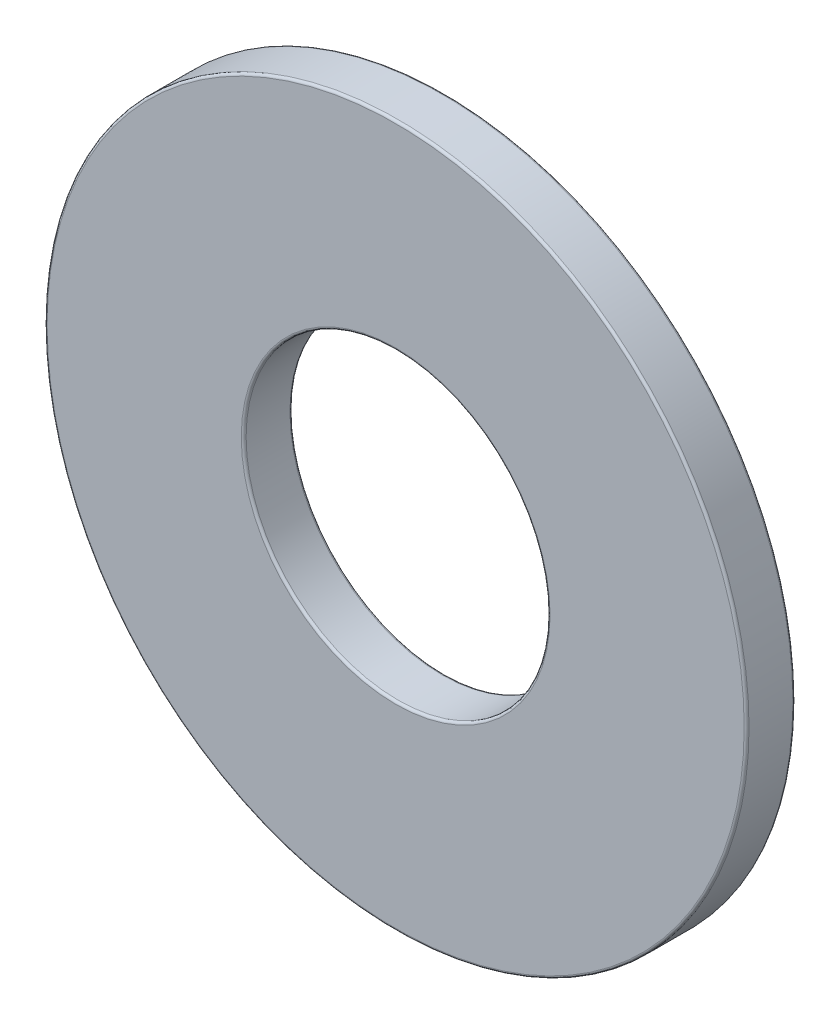
ISO-10303-21;
HEADER;
FILE_DESCRIPTION(('STEP AP214'),'2;1');
FILE_NAME('part.step','',(''),(''),'','','');
FILE_SCHEMA(('AUTOMOTIVE_DESIGN { 1 0 10303 214 1 1 1 1 }'));
ENDSEC;
DATA;
#1=APPLICATION_CONTEXT('core data for automotive mechanical design processes');
#2=APPLICATION_PROTOCOL_DEFINITION('international standard','automotive_design',2000,#1);
#3=PRODUCT_CONTEXT('',#1,'mechanical');
#4=PRODUCT('Part','Part','',(#3));
#5=PRODUCT_RELATED_PRODUCT_CATEGORY('part','',(#4));
#6=PRODUCT_DEFINITION_FORMATION('','',#4);
#7=PRODUCT_DEFINITION_CONTEXT('part definition',#1,'design');
#8=PRODUCT_DEFINITION('design','',#6,#7);
#9=PRODUCT_DEFINITION_SHAPE('','',#8);
#10=(LENGTH_UNIT() NAMED_UNIT(*) SI_UNIT(.MILLI.,.METRE.));
#11=(NAMED_UNIT(*) PLANE_ANGLE_UNIT() SI_UNIT($,.RADIAN.));
#12=(NAMED_UNIT(*) SI_UNIT($,.STERADIAN.) SOLID_ANGLE_UNIT());
#13=UNCERTAINTY_MEASURE_WITH_UNIT(LENGTH_MEASURE(1.E-05),#10,'distance_accuracy_value','');
#14=(GEOMETRIC_REPRESENTATION_CONTEXT(3) GLOBAL_UNCERTAINTY_ASSIGNED_CONTEXT((#13)) GLOBAL_UNIT_ASSIGNED_CONTEXT((#10,
#11,#12)) REPRESENTATION_CONTEXT('',''));
#15=CARTESIAN_POINT('',(0.,0.,0.));
#16=DIRECTION('',(0.,0.,1.));
#17=DIRECTION('',(1.,0.,0.));
#18=AXIS2_PLACEMENT_3D('',#15,#16,#17);
#19=CARTESIAN_POINT('',(0.,0.,1.651));
#20=DIRECTION('',(0.,0.,1.));
#21=DIRECTION('',(1.,0.,0.));
#22=AXIS2_PLACEMENT_3D('',#19,#20,#21);
#23=PLANE('',#22);
#24=CARTESIAN_POINT('',(0.,0.,1.651));
#25=DIRECTION('',(0.,0.,1.));
#26=DIRECTION('',(1.,0.,0.));
#27=AXIS2_PLACEMENT_3D('',#24,#25,#26);
#28=CIRCLE('',#27,10.4775);
#29=CARTESIAN_POINT('',(10.4775,0.,1.651));
#30=VERTEX_POINT('',#29);
#31=EDGE_CURVE('E10',#30,#30,#28,.F.);
#32=ORIENTED_EDGE('',*,*,#31,.T.);
#33=EDGE_LOOP('',(#32));
#34=FACE_BOUND('',#33,.T.);
#35=CARTESIAN_POINT('',(0.,0.,1.651));
#36=DIRECTION('',(0.,0.,1.));
#37=DIRECTION('',(1.,0.,0.));
#38=AXIS2_PLACEMENT_3D('',#35,#36,#37);
#39=CIRCLE('',#38,23.6474);
#40=CARTESIAN_POINT('',(23.6474,0.,1.651));
#41=VERTEX_POINT('',#40);
#42=EDGE_CURVE('E42',#41,#41,#39,.T.);
#43=ORIENTED_EDGE('',*,*,#42,.T.);
#44=EDGE_LOOP('',(#43));
#45=FACE_BOUND('',#44,.T.);
#46=ADVANCED_FACE('F35',(#34,#45),#23,.T.);
#47=CARTESIAN_POINT('',(0.,0.,-1.651));
#48=DIRECTION('',(0.,0.,1.));
#49=DIRECTION('',(1.,0.,0.));
#50=AXIS2_PLACEMENT_3D('',#47,#48,#49);
#51=PLANE('',#50);
#52=CARTESIAN_POINT('',(0.,0.,-1.651));
#53=DIRECTION('',(0.,0.,1.));
#54=DIRECTION('',(1.,0.,0.));
#55=AXIS2_PLACEMENT_3D('',#52,#53,#54);
#56=CIRCLE('',#55,10.4775);
#57=CARTESIAN_POINT('',(10.4775,0.,-1.651));
#58=VERTEX_POINT('',#57);
#59=EDGE_CURVE('E61',#58,#58,#56,.T.);
#60=ORIENTED_EDGE('',*,*,#59,.T.);
#61=EDGE_LOOP('',(#60));
#62=FACE_BOUND('',#61,.T.);
#63=CARTESIAN_POINT('',(0.,0.,-1.651));
#64=DIRECTION('',(0.,0.,1.));
#65=DIRECTION('',(1.,0.,0.));
#66=AXIS2_PLACEMENT_3D('',#63,#64,#65);
#67=CIRCLE('',#66,23.6474);
#68=CARTESIAN_POINT('',(23.6474,0.,-1.651));
#69=VERTEX_POINT('',#68);
#70=EDGE_CURVE('E64',#69,#69,#67,.F.);
#71=ORIENTED_EDGE('',*,*,#70,.T.);
#72=EDGE_LOOP('',(#71));
#73=FACE_BOUND('',#72,.T.);
#74=ADVANCED_FACE('F68',(#62,#73),#51,.F.);
#75=CARTESIAN_POINT('',(0.,0.,1.651));
#76=DIRECTION('',(0.,0.,-1.));
#77=DIRECTION('',(-1.,0.,0.));
#78=AXIS2_PLACEMENT_3D('',#75,#76,#77);
#79=CYLINDRICAL_SURFACE('',#78,23.8125);
#80=CARTESIAN_POINT('',(0.,0.,-1.4859));
#81=DIRECTION('',(0.,0.,1.));
#82=DIRECTION('',(1.,0.,0.));
#83=AXIS2_PLACEMENT_3D('',#80,#81,#82);
#84=CIRCLE('',#83,23.8125);
#85=CARTESIAN_POINT('',(-23.8125,0.,-1.4859));
#86=VERTEX_POINT('',#85);
#87=EDGE_CURVE('E46',#86,#86,#84,.T.);
#88=CARTESIAN_POINT('',(0.,0.,1.4859));
#89=DIRECTION('',(0.,0.,1.));
#90=DIRECTION('',(1.,0.,0.));
#91=AXIS2_PLACEMENT_3D('',#88,#89,#90);
#92=CIRCLE('',#91,23.8125);
#93=CARTESIAN_POINT('',(-23.8125,0.,1.4859));
#94=VERTEX_POINT('',#93);
#95=EDGE_CURVE('E50',#94,#94,#92,.F.);
#96=CARTESIAN_POINT('',(-23.8125,0.,-1.4859));
#97=CARTESIAN_POINT('',(-23.8125,0.,-1.45494375));
#98=CARTESIAN_POINT('',(-23.8125,0.,-1.4239875));
#99=CARTESIAN_POINT('',(-23.8125,0.,-1.362075));
#100=CARTESIAN_POINT('',(-23.8125,0.,-1.33111875));
#101=CARTESIAN_POINT('',(-23.8125,0.,-1.26920625));
#102=CARTESIAN_POINT('',(-23.8125,0.,-1.23825));
#103=CARTESIAN_POINT('',(-23.8125,0.,-1.1763375));
#104=CARTESIAN_POINT('',(-23.8125,0.,-1.14538125));
#105=CARTESIAN_POINT('',(-23.8125,0.,-1.08346875));
#106=CARTESIAN_POINT('',(-23.8125,0.,-1.0525125));
#107=CARTESIAN_POINT('',(-23.8125,0.,-0.9906));
#108=CARTESIAN_POINT('',(-23.8125,0.,-0.95964375));
#109=CARTESIAN_POINT('',(-23.8125,0.,-0.89773125));
#110=CARTESIAN_POINT('',(-23.8125,0.,-0.866775));
#111=CARTESIAN_POINT('',(-23.8125,0.,-0.8048625));
#112=CARTESIAN_POINT('',(-23.8125,0.,-0.77390625));
#113=CARTESIAN_POINT('',(-23.8125,0.,-0.71199375));
#114=CARTESIAN_POINT('',(-23.8125,0.,-0.6810375));
#115=CARTESIAN_POINT('',(-23.8125,0.,-0.619125));
#116=CARTESIAN_POINT('',(-23.8125,0.,-0.58816875));
#117=CARTESIAN_POINT('',(-23.8125,0.,-0.52625625));
#118=CARTESIAN_POINT('',(-23.8125,0.,-0.4953));
#119=CARTESIAN_POINT('',(-23.8125,0.,-0.4333875));
#120=CARTESIAN_POINT('',(-23.8125,0.,-0.40243125));
#121=CARTESIAN_POINT('',(-23.8125,0.,-0.34051875));
#122=CARTESIAN_POINT('',(-23.8125,0.,-0.3095625));
#123=CARTESIAN_POINT('',(-23.8125,0.,-0.24765));
#124=CARTESIAN_POINT('',(-23.8125,0.,-0.21669375));
#125=CARTESIAN_POINT('',(-23.8125,0.,-0.15478125));
#126=CARTESIAN_POINT('',(-23.8125,0.,-0.123825));
#127=CARTESIAN_POINT('',(-23.8125,0.,-0.0619125000000003));
#128=CARTESIAN_POINT('',(-23.8125,0.,-0.0309562500000003));
#129=CARTESIAN_POINT('',(-23.8125,0.,0.0309562499999998));
#130=CARTESIAN_POINT('',(-23.8125,0.,0.0619124999999999));
#131=CARTESIAN_POINT('',(-23.8125,0.,0.123825));
#132=CARTESIAN_POINT('',(-23.8125,0.,0.15478125));
#133=CARTESIAN_POINT('',(-23.8125,0.,0.21669375));
#134=CARTESIAN_POINT('',(-23.8125,0.,0.24765));
#135=CARTESIAN_POINT('',(-23.8125,0.,0.3095625));
#136=CARTESIAN_POINT('',(-23.8125,0.,0.34051875));
#137=CARTESIAN_POINT('',(-23.8125,0.,0.40243125));
#138=CARTESIAN_POINT('',(-23.8125,0.,0.4333875));
#139=CARTESIAN_POINT('',(-23.8125,0.,0.4953));
#140=CARTESIAN_POINT('',(-23.8125,0.,0.52625625));
#141=CARTESIAN_POINT('',(-23.8125,0.,0.58816875));
#142=CARTESIAN_POINT('',(-23.8125,0.,0.619125));
#143=CARTESIAN_POINT('',(-23.8125,0.,0.6810375));
#144=CARTESIAN_POINT('',(-23.8125,0.,0.71199375));
#145=CARTESIAN_POINT('',(-23.8125,0.,0.77390625));
#146=CARTESIAN_POINT('',(-23.8125,0.,0.8048625));
#147=CARTESIAN_POINT('',(-23.8125,0.,0.866775));
#148=CARTESIAN_POINT('',(-23.8125,0.,0.89773125));
#149=CARTESIAN_POINT('',(-23.8125,0.,0.95964375));
#150=CARTESIAN_POINT('',(-23.8125,0.,0.9906));
#151=CARTESIAN_POINT('',(-23.8125,0.,1.0525125));
#152=CARTESIAN_POINT('',(-23.8125,0.,1.08346875));
#153=CARTESIAN_POINT('',(-23.8125,0.,1.14538125));
#154=CARTESIAN_POINT('',(-23.8125,0.,1.1763375));
#155=CARTESIAN_POINT('',(-23.8125,0.,1.23825));
#156=CARTESIAN_POINT('',(-23.8125,0.,1.26920625));
#157=CARTESIAN_POINT('',(-23.8125,0.,1.33111875));
#158=CARTESIAN_POINT('',(-23.8125,0.,1.362075));
#159=CARTESIAN_POINT('',(-23.8125,0.,1.4239875));
#160=CARTESIAN_POINT('',(-23.8125,0.,1.45494375));
#161=CARTESIAN_POINT('',(-23.8125,0.,1.4859));
#162=B_SPLINE_CURVE_WITH_KNOTS('',3,(#96,#97,#98,#99,#100,#101,#102,#103,#104,#105,#106,#107,
#108,#109,#110,#111,#112,#113,#114,#115,#116,#117,#118,#119,#120,#121,#122,#123,#124,#125,#126,
#127,#128,#129,#130,#131,#132,#133,#134,#135,#136,#137,#138,#139,#140,#141,#142,#143,#144,#145,
#146,#147,#148,#149,#150,#151,#152,#153,#154,#155,#156,#157,#158,#159,#160,#161),.UNSPECIFIED.,
.F.,.F.,(4,2,2,2,2,2,2,2,2,2,2,2,2,2,2,2,2,2,2,2,2,2,2,2,2,2,2,2,2,2,2,2,4),(0.,
0.0928687499999999,0.1857375,0.27860625,0.371475,0.46434375,0.5572125,0.65008125,0.74295,
0.83581875,0.9286875,1.02155625,1.114425,1.20729375,1.3001625,1.39303125,1.4859,1.57876875,
1.6716375,1.76450625,1.857375,1.95024375,2.0431125,2.13598125,2.22885,2.32171875,2.4145875,
2.50745625,2.600325,2.69319375,2.7860625,2.87893125,2.9718),.UNSPECIFIED.);
#163=EDGE_CURVE('BSEAM78',#86,#94,#162,.T.);
#164=ORIENTED_EDGE('',*,*,#87,.T.);
#165=ORIENTED_EDGE('',*,*,#95,.T.);
#166=ORIENTED_EDGE('',*,*,#163,.T.);
#167=ORIENTED_EDGE('',*,*,#163,.F.);
#168=EDGE_LOOP('',(#164,#166,#165,#167));
#169=FACE_BOUND('',#168,.T.);
#170=ADVANCED_FACE('F78',(#169),#79,.T.);
#171=CARTESIAN_POINT('',(0.,0.,1.651));
#172=DIRECTION('',(0.,0.,-1.));
#173=DIRECTION('',(-1.,0.,0.));
#174=AXIS2_PLACEMENT_3D('',#171,#172,#173);
#175=CYLINDRICAL_SURFACE('',#174,10.3124);
#176=CARTESIAN_POINT('',(0.,0.,-1.4859));
#177=DIRECTION('',(0.,0.,1.));
#178=DIRECTION('',(1.,0.,0.));
#179=AXIS2_PLACEMENT_3D('',#176,#177,#178);
#180=CIRCLE('',#179,10.3124);
#181=CARTESIAN_POINT('',(-10.3124,0.,-1.4859));
#182=VERTEX_POINT('',#181);
#183=EDGE_CURVE('E55',#182,#182,#180,.F.);
#184=CARTESIAN_POINT('',(0.,0.,1.4859));
#185=DIRECTION('',(0.,0.,1.));
#186=DIRECTION('',(1.,0.,0.));
#187=AXIS2_PLACEMENT_3D('',#184,#185,#186);
#188=CIRCLE('',#187,10.3124);
#189=CARTESIAN_POINT('',(-10.3124,0.,1.4859));
#190=VERTEX_POINT('',#189);
#191=EDGE_CURVE('E58',#190,#190,#188,.T.);
#192=CARTESIAN_POINT('',(-10.3124,0.,-1.4859));
#193=CARTESIAN_POINT('',(-10.3124,0.,-1.45494375));
#194=CARTESIAN_POINT('',(-10.3124,0.,-1.4239875));
#195=CARTESIAN_POINT('',(-10.3124,0.,-1.362075));
#196=CARTESIAN_POINT('',(-10.3124,0.,-1.33111875));
#197=CARTESIAN_POINT('',(-10.3124,0.,-1.26920625));
#198=CARTESIAN_POINT('',(-10.3124,0.,-1.23825));
#199=CARTESIAN_POINT('',(-10.3124,0.,-1.1763375));
#200=CARTESIAN_POINT('',(-10.3124,0.,-1.14538125));
#201=CARTESIAN_POINT('',(-10.3124,0.,-1.08346875));
#202=CARTESIAN_POINT('',(-10.3124,0.,-1.0525125));
#203=CARTESIAN_POINT('',(-10.3124,0.,-0.9906));
#204=CARTESIAN_POINT('',(-10.3124,0.,-0.95964375));
#205=CARTESIAN_POINT('',(-10.3124,0.,-0.89773125));
#206=CARTESIAN_POINT('',(-10.3124,0.,-0.866775));
#207=CARTESIAN_POINT('',(-10.3124,0.,-0.8048625));
#208=CARTESIAN_POINT('',(-10.3124,0.,-0.77390625));
#209=CARTESIAN_POINT('',(-10.3124,0.,-0.71199375));
#210=CARTESIAN_POINT('',(-10.3124,0.,-0.6810375));
#211=CARTESIAN_POINT('',(-10.3124,0.,-0.619125));
#212=CARTESIAN_POINT('',(-10.3124,0.,-0.58816875));
#213=CARTESIAN_POINT('',(-10.3124,0.,-0.52625625));
#214=CARTESIAN_POINT('',(-10.3124,0.,-0.4953));
#215=CARTESIAN_POINT('',(-10.3124,0.,-0.4333875));
#216=CARTESIAN_POINT('',(-10.3124,0.,-0.40243125));
#217=CARTESIAN_POINT('',(-10.3124,0.,-0.34051875));
#218=CARTESIAN_POINT('',(-10.3124,0.,-0.3095625));
#219=CARTESIAN_POINT('',(-10.3124,0.,-0.24765));
#220=CARTESIAN_POINT('',(-10.3124,0.,-0.21669375));
#221=CARTESIAN_POINT('',(-10.3124,0.,-0.15478125));
#222=CARTESIAN_POINT('',(-10.3124,0.,-0.123825));
#223=CARTESIAN_POINT('',(-10.3124,0.,-0.0619125000000003));
#224=CARTESIAN_POINT('',(-10.3124,0.,-0.0309562500000003));
#225=CARTESIAN_POINT('',(-10.3124,0.,0.0309562499999998));
#226=CARTESIAN_POINT('',(-10.3124,0.,0.0619124999999999));
#227=CARTESIAN_POINT('',(-10.3124,0.,0.123825));
#228=CARTESIAN_POINT('',(-10.3124,0.,0.15478125));
#229=CARTESIAN_POINT('',(-10.3124,0.,0.21669375));
#230=CARTESIAN_POINT('',(-10.3124,0.,0.24765));
#231=CARTESIAN_POINT('',(-10.3124,0.,0.3095625));
#232=CARTESIAN_POINT('',(-10.3124,0.,0.34051875));
#233=CARTESIAN_POINT('',(-10.3124,0.,0.40243125));
#234=CARTESIAN_POINT('',(-10.3124,0.,0.4333875));
#235=CARTESIAN_POINT('',(-10.3124,0.,0.4953));
#236=CARTESIAN_POINT('',(-10.3124,0.,0.52625625));
#237=CARTESIAN_POINT('',(-10.3124,0.,0.58816875));
#238=CARTESIAN_POINT('',(-10.3124,0.,0.619125));
#239=CARTESIAN_POINT('',(-10.3124,0.,0.6810375));
#240=CARTESIAN_POINT('',(-10.3124,0.,0.71199375));
#241=CARTESIAN_POINT('',(-10.3124,0.,0.77390625));
#242=CARTESIAN_POINT('',(-10.3124,0.,0.8048625));
#243=CARTESIAN_POINT('',(-10.3124,0.,0.866775));
#244=CARTESIAN_POINT('',(-10.3124,0.,0.89773125));
#245=CARTESIAN_POINT('',(-10.3124,0.,0.95964375));
#246=CARTESIAN_POINT('',(-10.3124,0.,0.9906));
#247=CARTESIAN_POINT('',(-10.3124,0.,1.0525125));
#248=CARTESIAN_POINT('',(-10.3124,0.,1.08346875));
#249=CARTESIAN_POINT('',(-10.3124,0.,1.14538125));
#250=CARTESIAN_POINT('',(-10.3124,0.,1.1763375));
#251=CARTESIAN_POINT('',(-10.3124,0.,1.23825));
#252=CARTESIAN_POINT('',(-10.3124,0.,1.26920625));
#253=CARTESIAN_POINT('',(-10.3124,0.,1.33111875));
#254=CARTESIAN_POINT('',(-10.3124,0.,1.362075));
#255=CARTESIAN_POINT('',(-10.3124,0.,1.4239875));
#256=CARTESIAN_POINT('',(-10.3124,0.,1.45494375));
#257=CARTESIAN_POINT('',(-10.3124,0.,1.4859));
#258=B_SPLINE_CURVE_WITH_KNOTS('',3,(#192,#193,#194,#195,#196,#197,#198,#199,#200,#201,#202,
#203,#204,#205,#206,#207,#208,#209,#210,#211,#212,#213,#214,#215,#216,#217,#218,#219,#220,#221,
#222,#223,#224,#225,#226,#227,#228,#229,#230,#231,#232,#233,#234,#235,#236,#237,#238,#239,#240,
#241,#242,#243,#244,#245,#246,#247,#248,#249,#250,#251,#252,#253,#254,#255,#256,#257),
.UNSPECIFIED.,.F.,.F.,(4,2,2,2,2,2,2,2,2,2,2,2,2,2,2,2,2,2,2,2,2,2,2,2,2,2,2,2,2,2,2,2,4),(0.,
0.0928687499999999,0.1857375,0.27860625,0.371475,0.46434375,0.5572125,0.65008125,0.74295,
0.83581875,0.9286875,1.02155625,1.114425,1.20729375,1.3001625,1.39303125,1.4859,1.57876875,
1.6716375,1.76450625,1.857375,1.95024375,2.0431125,2.13598125,2.22885,2.32171875,2.4145875,
2.50745625,2.600325,2.69319375,2.7860625,2.87893125,2.9718),.UNSPECIFIED.);
#259=EDGE_CURVE('BSEAM81',#182,#190,#258,.T.);
#260=ORIENTED_EDGE('',*,*,#183,.T.);
#261=ORIENTED_EDGE('',*,*,#191,.T.);
#262=ORIENTED_EDGE('',*,*,#259,.T.);
#263=ORIENTED_EDGE('',*,*,#259,.F.);
#264=EDGE_LOOP('',(#260,#262,#261,#263));
#265=FACE_BOUND('',#264,.T.);
#266=ADVANCED_FACE('F81',(#265),#175,.F.);
#267=CARTESIAN_POINT('',(0.,0.,-1.4859));
#268=DIRECTION('',(0.,0.,1.));
#269=DIRECTION('',(1.,0.,0.));
#270=AXIS2_PLACEMENT_3D('',#267,#268,#269);
#271=TOROIDAL_SURFACE('',#270,10.4775,0.1651);
#272=ORIENTED_EDGE('',*,*,#183,.F.);
#273=EDGE_LOOP('',(#272));
#274=FACE_BOUND('',#273,.T.);
#275=ORIENTED_EDGE('',*,*,#59,.F.);
#276=EDGE_LOOP('',(#275));
#277=FACE_BOUND('',#276,.T.);
#278=ADVANCED_FACE('F74',(#274,#277),#271,.T.);
#279=CARTESIAN_POINT('',(0.,0.,-1.4859));
#280=DIRECTION('',(0.,0.,1.));
#281=DIRECTION('',(1.,0.,0.));
#282=AXIS2_PLACEMENT_3D('',#279,#280,#281);
#283=TOROIDAL_SURFACE('',#282,23.6474,0.1651);
#284=ORIENTED_EDGE('',*,*,#70,.F.);
#285=EDGE_LOOP('',(#284));
#286=FACE_BOUND('',#285,.T.);
#287=ORIENTED_EDGE('',*,*,#87,.F.);
#288=EDGE_LOOP('',(#287));
#289=FACE_BOUND('',#288,.T.);
#290=ADVANCED_FACE('F70',(#286,#289),#283,.T.);
#291=CARTESIAN_POINT('',(0.,0.,1.4859));
#292=DIRECTION('',(0.,0.,1.));
#293=DIRECTION('',(1.,0.,0.));
#294=AXIS2_PLACEMENT_3D('',#291,#292,#293);
#295=TOROIDAL_SURFACE('',#294,10.4775,0.1651);
#296=ORIENTED_EDGE('',*,*,#31,.F.);
#297=EDGE_LOOP('',(#296));
#298=FACE_BOUND('',#297,.T.);
#299=ORIENTED_EDGE('',*,*,#191,.F.);
#300=EDGE_LOOP('',(#299));
#301=FACE_BOUND('',#300,.T.);
#302=ADVANCED_FACE('F73',(#298,#301),#295,.T.);
#303=CARTESIAN_POINT('',(0.,0.,1.4859));
#304=DIRECTION('',(0.,0.,1.));
#305=DIRECTION('',(1.,0.,0.));
#306=AXIS2_PLACEMENT_3D('',#303,#304,#305);
#307=TOROIDAL_SURFACE('',#306,23.6474,0.1651);
#308=ORIENTED_EDGE('',*,*,#95,.F.);
#309=EDGE_LOOP('',(#308));
#310=FACE_BOUND('',#309,.T.);
#311=ORIENTED_EDGE('',*,*,#42,.F.);
#312=EDGE_LOOP('',(#311));
#313=FACE_BOUND('',#312,.T.);
#314=ADVANCED_FACE('F37',(#310,#313),#307,.T.);
#315=CLOSED_SHELL('',(#46,#74,#170,#266,#278,#290,#302,#314));
#316=MANIFOLD_SOLID_BREP('B2',#315);
#317=ADVANCED_BREP_SHAPE_REPRESENTATION('',(#18,#316),#14);
#318=SHAPE_DEFINITION_REPRESENTATION(#9,#317);
ENDSEC;
END-ISO-10303-21;
